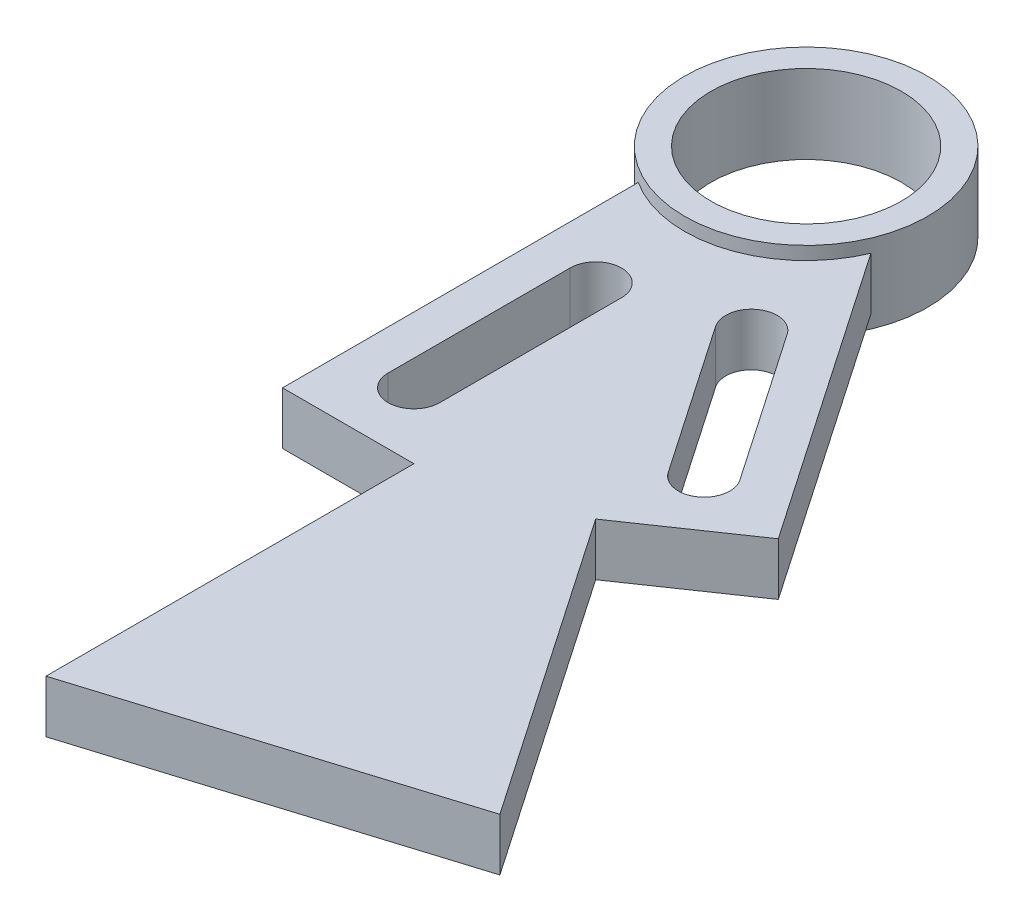
ISO-10303-21;
HEADER;
FILE_DESCRIPTION(('STEP AP214'),'2;1');
FILE_NAME('part.step','',(''),(''),'','','');
FILE_SCHEMA(('AUTOMOTIVE_DESIGN { 1 0 10303 214 1 1 1 1 }'));
ENDSEC;
DATA;
#1=APPLICATION_CONTEXT('core data for automotive mechanical design processes');
#2=APPLICATION_PROTOCOL_DEFINITION('international standard','automotive_design',2000,#1);
#3=PRODUCT_CONTEXT('',#1,'mechanical');
#4=PRODUCT('Part','Part','',(#3));
#5=PRODUCT_RELATED_PRODUCT_CATEGORY('part','',(#4));
#6=PRODUCT_DEFINITION_FORMATION('','',#4);
#7=PRODUCT_DEFINITION_CONTEXT('part definition',#1,'design');
#8=PRODUCT_DEFINITION('design','',#6,#7);
#9=PRODUCT_DEFINITION_SHAPE('','',#8);
#10=(LENGTH_UNIT() NAMED_UNIT(*) SI_UNIT(.MILLI.,.METRE.));
#11=(NAMED_UNIT(*) PLANE_ANGLE_UNIT() SI_UNIT($,.RADIAN.));
#12=(NAMED_UNIT(*) SI_UNIT($,.STERADIAN.) SOLID_ANGLE_UNIT());
#13=UNCERTAINTY_MEASURE_WITH_UNIT(LENGTH_MEASURE(1.E-05),#10,'distance_accuracy_value','');
#14=(GEOMETRIC_REPRESENTATION_CONTEXT(3) GLOBAL_UNCERTAINTY_ASSIGNED_CONTEXT((#13)) GLOBAL_UNIT_ASSIGNED_CONTEXT((#10,
#11,#12)) REPRESENTATION_CONTEXT('',''));
#15=CARTESIAN_POINT('',(0.,0.,0.));
#16=DIRECTION('',(0.,0.,1.));
#17=DIRECTION('',(1.,0.,0.));
#18=AXIS2_PLACEMENT_3D('',#15,#16,#17);
#19=CARTESIAN_POINT('',(0.,4.7625,0.));
#20=DIRECTION('',(0.,-1.,0.));
#21=DIRECTION('',(0.,0.,-1.));
#22=AXIS2_PLACEMENT_3D('',#19,#20,#21);
#23=CYLINDRICAL_SURFACE('',#22,11.5062);
#24=CARTESIAN_POINT('',(0.,4.7625,0.));
#25=DIRECTION('',(0.,1.,0.));
#26=DIRECTION('',(0.,0.,1.));
#27=AXIS2_PLACEMENT_3D('',#24,#25,#26);
#28=CIRCLE('',#27,11.5062);
#29=CARTESIAN_POINT('',(0.,4.7625,-11.5062));
#30=VERTEX_POINT('',#29);
#31=EDGE_CURVE('E51',#30,#30,#28,.T.);
#32=CARTESIAN_POINT('',(0.,-4.7625,0.));
#33=DIRECTION('',(0.,1.,0.));
#34=DIRECTION('',(0.,0.,1.));
#35=AXIS2_PLACEMENT_3D('',#32,#33,#34);
#36=CIRCLE('',#35,11.5062);
#37=CARTESIAN_POINT('',(0.,-4.7625,-11.5062));
#38=VERTEX_POINT('',#37);
#39=EDGE_CURVE('E271',#38,#38,#36,.T.);
#40=CARTESIAN_POINT('',(0.,4.7625,-11.5062));
#41=CARTESIAN_POINT('',(0.,4.66328125,-11.5062));
#42=CARTESIAN_POINT('',(0.,4.5640625,-11.5062));
#43=CARTESIAN_POINT('',(0.,4.365625,-11.5062));
#44=CARTESIAN_POINT('',(0.,4.26640625,-11.5062));
#45=CARTESIAN_POINT('',(0.,4.06796875,-11.5062));
#46=CARTESIAN_POINT('',(0.,3.96875,-11.5062));
#47=CARTESIAN_POINT('',(0.,3.7703125,-11.5062));
#48=CARTESIAN_POINT('',(0.,3.67109375,-11.5062));
#49=CARTESIAN_POINT('',(0.,3.47265625,-11.5062));
#50=CARTESIAN_POINT('',(0.,3.3734375,-11.5062));
#51=CARTESIAN_POINT('',(0.,3.175,-11.5062));
#52=CARTESIAN_POINT('',(0.,3.07578125,-11.5062));
#53=CARTESIAN_POINT('',(0.,2.87734375,-11.5062));
#54=CARTESIAN_POINT('',(0.,2.778125,-11.5062));
#55=CARTESIAN_POINT('',(0.,2.5796875,-11.5062));
#56=CARTESIAN_POINT('',(0.,2.48046875,-11.5062));
#57=CARTESIAN_POINT('',(0.,2.28203125,-11.5062));
#58=CARTESIAN_POINT('',(0.,2.1828125,-11.5062));
#59=CARTESIAN_POINT('',(0.,1.984375,-11.5062));
#60=CARTESIAN_POINT('',(0.,1.88515625,-11.5062));
#61=CARTESIAN_POINT('',(0.,1.68671875,-11.5062));
#62=CARTESIAN_POINT('',(0.,1.5875,-11.5062));
#63=CARTESIAN_POINT('',(0.,1.3890625,-11.5062));
#64=CARTESIAN_POINT('',(0.,1.28984375,-11.5062));
#65=CARTESIAN_POINT('',(0.,1.09140625,-11.5062));
#66=CARTESIAN_POINT('',(0.,0.992187499999999,-11.5062));
#67=CARTESIAN_POINT('',(0.,0.79375,-11.5062));
#68=CARTESIAN_POINT('',(0.,0.69453125,-11.5062));
#69=CARTESIAN_POINT('',(0.,0.49609375,-11.5062));
#70=CARTESIAN_POINT('',(0.,0.396875,-11.5062));
#71=CARTESIAN_POINT('',(0.,0.1984375,-11.5062));
#72=CARTESIAN_POINT('',(0.,0.0992187500000001,-11.5062));
#73=CARTESIAN_POINT('',(0.,-0.0992187500000001,-11.5062));
#74=CARTESIAN_POINT('',(0.,-0.1984375,-11.5062));
#75=CARTESIAN_POINT('',(0.,-0.396875,-11.5062));
#76=CARTESIAN_POINT('',(0.,-0.49609375,-11.5062));
#77=CARTESIAN_POINT('',(0.,-0.69453125,-11.5062));
#78=CARTESIAN_POINT('',(0.,-0.793750000000001,-11.5062));
#79=CARTESIAN_POINT('',(0.,-0.992187500000001,-11.5062));
#80=CARTESIAN_POINT('',(0.,-1.09140625,-11.5062));
#81=CARTESIAN_POINT('',(0.,-1.28984375,-11.5062));
#82=CARTESIAN_POINT('',(0.,-1.3890625,-11.5062));
#83=CARTESIAN_POINT('',(0.,-1.5875,-11.5062));
#84=CARTESIAN_POINT('',(0.,-1.68671875,-11.5062));
#85=CARTESIAN_POINT('',(0.,-1.88515625,-11.5062));
#86=CARTESIAN_POINT('',(0.,-1.984375,-11.5062));
#87=CARTESIAN_POINT('',(0.,-2.1828125,-11.5062));
#88=CARTESIAN_POINT('',(0.,-2.28203125,-11.5062));
#89=CARTESIAN_POINT('',(0.,-2.48046875,-11.5062));
#90=CARTESIAN_POINT('',(0.,-2.5796875,-11.5062));
#91=CARTESIAN_POINT('',(0.,-2.778125,-11.5062));
#92=CARTESIAN_POINT('',(0.,-2.87734375,-11.5062));
#93=CARTESIAN_POINT('',(0.,-3.07578125,-11.5062));
#94=CARTESIAN_POINT('',(0.,-3.175,-11.5062));
#95=CARTESIAN_POINT('',(0.,-3.3734375,-11.5062));
#96=CARTESIAN_POINT('',(0.,-3.47265625,-11.5062));
#97=CARTESIAN_POINT('',(0.,-3.67109375,-11.5062));
#98=CARTESIAN_POINT('',(0.,-3.7703125,-11.5062));
#99=CARTESIAN_POINT('',(0.,-3.96875,-11.5062));
#100=CARTESIAN_POINT('',(0.,-4.06796875,-11.5062));
#101=CARTESIAN_POINT('',(0.,-4.26640625,-11.5062));
#102=CARTESIAN_POINT('',(0.,-4.365625,-11.5062));
#103=CARTESIAN_POINT('',(0.,-4.5640625,-11.5062));
#104=CARTESIAN_POINT('',(0.,-4.66328125,-11.5062));
#105=CARTESIAN_POINT('',(0.,-4.7625,-11.5062));
#106=B_SPLINE_CURVE_WITH_KNOTS('',3,(#40,#41,#42,#43,#44,#45,#46,#47,#48,#49,#50,#51,#52,#53,
#54,#55,#56,#57,#58,#59,#60,#61,#62,#63,#64,#65,#66,#67,#68,#69,#70,#71,#72,#73,#74,#75,#76,#77,
#78,#79,#80,#81,#82,#83,#84,#85,#86,#87,#88,#89,#90,#91,#92,#93,#94,#95,#96,#97,#98,#99,#100,
#101,#102,#103,#104,#105),.UNSPECIFIED.,.F.,.F.,(4,2,2,2,2,2,2,2,2,2,2,2,2,2,2,2,2,2,2,2,2,2,2,
2,2,2,2,2,2,2,2,2,4),(0.,0.29765625,0.5953125,0.892968750000001,1.190625,1.48828125,1.7859375,
2.08359375,2.38125,2.67890625,2.9765625,3.27421875,3.571875,3.86953125,4.1671875,4.46484375,
4.7625,5.06015625,5.3578125,5.65546875,5.953125,6.25078125,6.5484375,6.84609375,7.14375,
7.44140625,7.7390625,8.03671875,8.334375,8.63203125,8.9296875,9.22734375,9.525),.UNSPECIFIED.);
#107=EDGE_CURVE('BSEAM43',#30,#38,#106,.T.);
#108=ORIENTED_EDGE('',*,*,#31,.T.);
#109=ORIENTED_EDGE('',*,*,#39,.F.);
#110=ORIENTED_EDGE('',*,*,#107,.T.);
#111=ORIENTED_EDGE('',*,*,#107,.F.);
#112=EDGE_LOOP('',(#108,#110,#109,#111));
#113=FACE_BOUND('',#112,.T.);
#114=ADVANCED_FACE('F43',(#113),#23,.F.);
#115=CARTESIAN_POINT('',(0.,4.7625,0.));
#116=DIRECTION('',(0.,-1.,0.));
#117=DIRECTION('',(0.,0.,-1.));
#118=AXIS2_PLACEMENT_3D('',#115,#116,#117);
#119=CYLINDRICAL_SURFACE('',#118,14.6812);
#120=DIRECTION('',(0.,-1.,0.));
#121=VECTOR('',#120,1.);
#122=CARTESIAN_POINT('',(-7.93749999999998,3.175,12.3504545337409));
#123=LINE('',#122,#121);
#124=CARTESIAN_POINT('',(-7.93749999999998,3.175,12.3504545337409));
#125=VERTEX_POINT('',#124);
#126=CARTESIAN_POINT('',(-7.93749999999998,-3.175,12.3504545337409));
#127=VERTEX_POINT('',#126);
#128=EDGE_CURVE('E64',#125,#127,#123,.T.);
#129=ORIENTED_EDGE('',*,*,#128,.F.);
#130=CARTESIAN_POINT('',(0.,3.175,0.));
#131=DIRECTION('',(0.,1.,0.));
#132=DIRECTION('',(0.,0.,1.));
#133=AXIS2_PLACEMENT_3D('',#130,#131,#132);
#134=CIRCLE('',#133,14.6812);
#135=CARTESIAN_POINT('',(13.5264297592823,3.175,5.70730509147716));
#136=VERTEX_POINT('',#135);
#137=EDGE_CURVE('E59',#125,#136,#134,.T.);
#138=ORIENTED_EDGE('',*,*,#137,.T.);
#139=DIRECTION('',(0.,-1.,0.));
#140=VECTOR('',#139,1.);
#141=CARTESIAN_POINT('',(13.5264297592823,3.175,5.70730509147716));
#142=LINE('',#141,#140);
#143=CARTESIAN_POINT('',(13.5264297592823,-3.175,5.70730509147716));
#144=VERTEX_POINT('',#143);
#145=EDGE_CURVE('E282',#136,#144,#142,.T.);
#146=ORIENTED_EDGE('',*,*,#145,.T.);
#147=CARTESIAN_POINT('',(0.,-3.175,0.));
#148=DIRECTION('',(0.,1.,0.));
#149=DIRECTION('',(0.,0.,1.));
#150=AXIS2_PLACEMENT_3D('',#147,#148,#149);
#151=CIRCLE('',#150,14.6812);
#152=EDGE_CURVE('E236',#127,#144,#151,.T.);
#153=ORIENTED_EDGE('',*,*,#152,.F.);
#154=EDGE_LOOP('',(#129,#138,#146,#153));
#155=FACE_BOUND('',#154,.T.);
#156=CARTESIAN_POINT('',(0.,4.7625,0.));
#157=DIRECTION('',(0.,1.,0.));
#158=DIRECTION('',(0.,0.,1.));
#159=AXIS2_PLACEMENT_3D('',#156,#157,#158);
#160=CIRCLE('',#159,14.6812);
#161=CARTESIAN_POINT('',(0.,4.7625,14.6812));
#162=VERTEX_POINT('',#161);
#163=EDGE_CURVE('E11',#162,#162,#160,.T.);
#164=ORIENTED_EDGE('',*,*,#163,.F.);
#165=EDGE_LOOP('',(#164));
#166=FACE_BOUND('',#165,.T.);
#167=CARTESIAN_POINT('',(0.,-4.7625,0.));
#168=DIRECTION('',(0.,1.,0.));
#169=DIRECTION('',(0.,0.,1.));
#170=AXIS2_PLACEMENT_3D('',#167,#168,#169);
#171=CIRCLE('',#170,14.6812);
#172=CARTESIAN_POINT('',(0.,-4.7625,14.6812));
#173=VERTEX_POINT('',#172);
#174=EDGE_CURVE('E46',#173,#173,#171,.T.);
#175=ORIENTED_EDGE('',*,*,#174,.T.);
#176=EDGE_LOOP('',(#175));
#177=FACE_BOUND('',#176,.T.);
#178=ADVANCED_FACE('F299',(#155,#166,#177),#119,.T.);
#179=CARTESIAN_POINT('',(0.,4.7625,0.));
#180=DIRECTION('',(0.,1.,0.));
#181=DIRECTION('',(0.,0.,1.));
#182=AXIS2_PLACEMENT_3D('',#179,#180,#181);
#183=PLANE('',#182);
#184=ORIENTED_EDGE('',*,*,#31,.F.);
#185=EDGE_LOOP('',(#184));
#186=FACE_BOUND('',#185,.T.);
#187=ORIENTED_EDGE('',*,*,#163,.T.);
#188=EDGE_LOOP('',(#187));
#189=FACE_BOUND('',#188,.T.);
#190=ADVANCED_FACE('F304',(#186,#189),#183,.T.);
#191=CARTESIAN_POINT('',(0.,-4.7625,0.));
#192=DIRECTION('',(0.,1.,0.));
#193=DIRECTION('',(0.,0.,1.));
#194=AXIS2_PLACEMENT_3D('',#191,#192,#193);
#195=PLANE('',#194);
#196=ORIENTED_EDGE('',*,*,#39,.T.);
#197=EDGE_LOOP('',(#196));
#198=FACE_BOUND('',#197,.T.);
#199=ORIENTED_EDGE('',*,*,#174,.F.);
#200=EDGE_LOOP('',(#199));
#201=FACE_BOUND('',#200,.T.);
#202=ADVANCED_FACE('F301',(#198,#201),#195,.F.);
#203=CARTESIAN_POINT('',(0.,3.175,25.4127));
#204=DIRECTION('',(0.,-1.,0.));
#205=DIRECTION('',(0.,0.,-1.));
#206=AXIS2_PLACEMENT_3D('',#203,#204,#205);
#207=CYLINDRICAL_SURFACE('',#206,3.1115);
#208=CARTESIAN_POINT('',(0.,-3.175,25.4127));
#209=DIRECTION('',(0.,1.,0.));
#210=DIRECTION('',(0.,0.,1.));
#211=AXIS2_PLACEMENT_3D('',#208,#209,#210);
#212=CIRCLE('',#211,3.1115);
#213=CARTESIAN_POINT('',(3.1115,-3.175,25.4127));
#214=VERTEX_POINT('',#213);
#215=CARTESIAN_POINT('',(-3.11150000000001,-3.175,25.4127));
#216=VERTEX_POINT('',#215);
#217=EDGE_CURVE('E251',#214,#216,#212,.T.);
#218=ORIENTED_EDGE('',*,*,#217,.F.);
#219=DIRECTION('',(0.,-1.,0.));
#220=VECTOR('',#219,1.);
#221=CARTESIAN_POINT('',(3.1115,3.175,25.4127));
#222=LINE('',#221,#220);
#223=CARTESIAN_POINT('',(3.1115,3.175,25.4127));
#224=VERTEX_POINT('',#223);
#225=EDGE_CURVE('E269',#224,#214,#222,.T.);
#226=ORIENTED_EDGE('',*,*,#225,.F.);
#227=CARTESIAN_POINT('',(0.,3.175,25.4127));
#228=DIRECTION('',(0.,1.,0.));
#229=DIRECTION('',(0.,0.,1.));
#230=AXIS2_PLACEMENT_3D('',#227,#228,#229);
#231=CIRCLE('',#230,3.1115);
#232=CARTESIAN_POINT('',(-3.11150000000001,3.175,25.4127));
#233=VERTEX_POINT('',#232);
#234=EDGE_CURVE('E206',#224,#233,#231,.T.);
#235=ORIENTED_EDGE('',*,*,#234,.T.);
#236=DIRECTION('',(0.,-1.,0.));
#237=VECTOR('',#236,1.);
#238=CARTESIAN_POINT('',(-3.11150000000001,3.175,25.4127));
#239=LINE('',#238,#237);
#240=EDGE_CURVE('E262',#233,#216,#239,.T.);
#241=ORIENTED_EDGE('',*,*,#240,.T.);
#242=EDGE_LOOP('',(#218,#226,#235,#241));
#243=FACE_BOUND('',#242,.T.);
#244=ADVANCED_FACE('F303',(#243),#207,.F.);
#245=CARTESIAN_POINT('',(3.11149999999999,3.175,0.));
#246=DIRECTION('',(-1.,0.,0.));
#247=DIRECTION('',(0.,0.,1.));
#248=AXIS2_PLACEMENT_3D('',#245,#246,#247);
#249=PLANE('',#248);
#250=DIRECTION('',(0.,0.,-1.));
#251=VECTOR('',#250,1.);
#252=CARTESIAN_POINT('',(3.11149999999999,-3.175,0.));
#253=LINE('',#252,#251);
#254=CARTESIAN_POINT('',(3.1115,-3.175,47.3837));
#255=VERTEX_POINT('',#254);
#256=EDGE_CURVE('E254',#255,#214,#253,.T.);
#257=ORIENTED_EDGE('',*,*,#256,.F.);
#258=DIRECTION('',(0.,-1.,0.));
#259=VECTOR('',#258,1.);
#260=CARTESIAN_POINT('',(3.1115,3.175,47.3837));
#261=LINE('',#260,#259);
#262=CARTESIAN_POINT('',(3.1115,3.175,47.3837));
#263=VERTEX_POINT('',#262);
#264=EDGE_CURVE('E267',#263,#255,#261,.T.);
#265=ORIENTED_EDGE('',*,*,#264,.F.);
#266=DIRECTION('',(0.,0.,-1.));
#267=VECTOR('',#266,1.);
#268=CARTESIAN_POINT('',(3.11149999999999,3.175,0.));
#269=LINE('',#268,#267);
#270=EDGE_CURVE('E209',#263,#224,#269,.T.);
#271=ORIENTED_EDGE('',*,*,#270,.T.);
#272=ORIENTED_EDGE('',*,*,#225,.T.);
#273=EDGE_LOOP('',(#257,#265,#271,#272));
#274=FACE_BOUND('',#273,.T.);
#275=ADVANCED_FACE('F311',(#274),#249,.T.);
#276=CARTESIAN_POINT('',(0.,3.175,47.3837));
#277=DIRECTION('',(0.,-1.,0.));
#278=DIRECTION('',(0.,0.,-1.));
#279=AXIS2_PLACEMENT_3D('',#276,#277,#278);
#280=CYLINDRICAL_SURFACE('',#279,3.1115);
#281=CARTESIAN_POINT('',(0.,-3.175,47.3837));
#282=DIRECTION('',(0.,1.,0.));
#283=DIRECTION('',(0.,0.,1.));
#284=AXIS2_PLACEMENT_3D('',#281,#282,#283);
#285=CIRCLE('',#284,3.1115);
#286=CARTESIAN_POINT('',(-3.1115,-3.175,47.3837));
#287=VERTEX_POINT('',#286);
#288=EDGE_CURVE('E257',#287,#255,#285,.T.);
#289=ORIENTED_EDGE('',*,*,#288,.F.);
#290=DIRECTION('',(0.,-1.,0.));
#291=VECTOR('',#290,1.);
#292=CARTESIAN_POINT('',(-3.1115,3.175,47.3837));
#293=LINE('',#292,#291);
#294=CARTESIAN_POINT('',(-3.1115,3.175,47.3837));
#295=VERTEX_POINT('',#294);
#296=EDGE_CURVE('E264',#295,#287,#293,.T.);
#297=ORIENTED_EDGE('',*,*,#296,.F.);
#298=CARTESIAN_POINT('',(0.,3.175,47.3837));
#299=DIRECTION('',(0.,1.,0.));
#300=DIRECTION('',(0.,0.,1.));
#301=AXIS2_PLACEMENT_3D('',#298,#299,#300);
#302=CIRCLE('',#301,3.1115);
#303=EDGE_CURVE('E212',#295,#263,#302,.T.);
#304=ORIENTED_EDGE('',*,*,#303,.T.);
#305=ORIENTED_EDGE('',*,*,#264,.T.);
#306=EDGE_LOOP('',(#289,#297,#304,#305));
#307=FACE_BOUND('',#306,.T.);
#308=ADVANCED_FACE('F340',(#307),#280,.F.);
#309=CARTESIAN_POINT('',(-6.54973750062605,3.175,4.48384265144171));
#310=DIRECTION('',(0.825163779606464,0.,-0.56489356238638));
#311=DIRECTION('',(-0.56489356238638,0.,-0.825163779606464));
#312=AXIS2_PLACEMENT_3D('',#309,#310,#311);
#313=PLANE('',#312);
#314=DIRECTION('',(0.56489356238638,0.,0.825163779606464));
#315=VECTOR('',#314,1.);
#316=CARTESIAN_POINT('',(-6.54973750062605,-3.175,4.48384265144171));
#317=LINE('',#316,#315);
#318=CARTESIAN_POINT('',(24.7008522428634,-3.175,50.1328931358069));
#319=VERTEX_POINT('',#318);
#320=CARTESIAN_POINT('',(49.8103710909379,-3.175,86.8114231393142));
#321=VERTEX_POINT('',#320);
#322=EDGE_CURVE('E227',#319,#321,#317,.T.);
#323=ORIENTED_EDGE('',*,*,#322,.F.);
#324=DIRECTION('',(0.,-1.,0.));
#325=VECTOR('',#324,1.);
#326=CARTESIAN_POINT('',(24.7008522428634,3.175,50.1328931358069));
#327=LINE('',#326,#325);
#328=CARTESIAN_POINT('',(24.7008522428634,3.175,50.1328931358069));
#329=VERTEX_POINT('',#328);
#330=EDGE_CURVE('E265',#329,#319,#327,.T.);
#331=ORIENTED_EDGE('',*,*,#330,.F.);
#332=DIRECTION('',(0.56489356238638,0.,0.825163779606464));
#333=VECTOR('',#332,1.);
#334=CARTESIAN_POINT('',(-6.54973750062605,3.175,4.48384265144171));
#335=LINE('',#334,#333);
#336=CARTESIAN_POINT('',(49.8103710909379,3.175,86.8114231393142));
#337=VERTEX_POINT('',#336);
#338=EDGE_CURVE('E186',#329,#337,#335,.T.);
#339=ORIENTED_EDGE('',*,*,#338,.T.);
#340=DIRECTION('',(0.,-1.,0.));
#341=VECTOR('',#340,1.);
#342=CARTESIAN_POINT('',(49.8103710909379,3.175,86.8114231393142));
#343=LINE('',#342,#341);
#344=EDGE_CURVE('E165',#337,#321,#343,.T.);
#345=ORIENTED_EDGE('',*,*,#344,.T.);
#346=EDGE_LOOP('',(#323,#331,#339,#345));
#347=FACE_BOUND('',#346,.T.);
#348=ADVANCED_FACE('F349',(#347),#313,.T.);
#349=CARTESIAN_POINT('',(31.2505897434894,3.175,45.6490504843651));
#350=DIRECTION('',(-0.56489356238638,0.,-0.825163779606464));
#351=DIRECTION('',(-0.825163779606464,0.,0.56489356238638));
#352=AXIS2_PLACEMENT_3D('',#349,#350,#351);
#353=PLANE('',#352);
#354=DIRECTION('',(0.825163779606464,0.,-0.56489356238638));
#355=VECTOR('',#354,1.);
#356=CARTESIAN_POINT('',(31.2505897434894,-3.175,45.6490504843651));
#357=LINE('',#356,#355);
#358=CARTESIAN_POINT('',(37.800327244116,-3.175,41.1652078329231));
#359=VERTEX_POINT('',#358);
#360=EDGE_CURVE('E230',#319,#359,#357,.T.);
#361=ORIENTED_EDGE('',*,*,#360,.T.);
#362=DIRECTION('',(0.,-1.,0.));
#363=VECTOR('',#362,1.);
#364=CARTESIAN_POINT('',(37.800327244116,3.175,41.1652078329231));
#365=LINE('',#364,#363);
#366=CARTESIAN_POINT('',(37.800327244116,3.175,41.1652078329231));
#367=VERTEX_POINT('',#366);
#368=EDGE_CURVE('E284',#367,#359,#365,.T.);
#369=ORIENTED_EDGE('',*,*,#368,.F.);
#370=DIRECTION('',(0.825163779606464,0.,-0.56489356238638));
#371=VECTOR('',#370,1.);
#372=CARTESIAN_POINT('',(31.2505897434894,3.175,45.6490504843651));
#373=LINE('',#372,#371);
#374=EDGE_CURVE('E189',#329,#367,#373,.T.);
#375=ORIENTED_EDGE('',*,*,#374,.F.);
#376=ORIENTED_EDGE('',*,*,#330,.T.);
#377=EDGE_LOOP('',(#361,#369,#375,#376));
#378=FACE_BOUND('',#377,.T.);
#379=ADVANCED_FACE('F358',(#378),#353,.F.);
#380=CARTESIAN_POINT('',(6.54973750062657,3.175,-4.48384265144207));
#381=DIRECTION('',(-0.825163779606464,0.,0.56489356238638));
#382=DIRECTION('',(0.56489356238638,0.,0.825163779606464));
#383=AXIS2_PLACEMENT_3D('',#380,#381,#382);
#384=PLANE('',#383);
#385=DIRECTION('',(-0.56489356238638,0.,-0.825163779606464));
#386=VECTOR('',#385,1.);
#387=CARTESIAN_POINT('',(6.54973750062657,-3.175,-4.48384265144207));
#388=LINE('',#387,#386);
#389=EDGE_CURVE('E233',#359,#144,#388,.T.);
#390=ORIENTED_EDGE('',*,*,#389,.T.);
#391=ORIENTED_EDGE('',*,*,#145,.F.);
#392=DIRECTION('',(-0.56489356238638,0.,-0.825163779606464));
#393=VECTOR('',#392,1.);
#394=CARTESIAN_POINT('',(6.54973750062657,3.175,-4.48384265144207));
#395=LINE('',#394,#393);
#396=EDGE_CURVE('E192',#367,#136,#395,.T.);
#397=ORIENTED_EDGE('',*,*,#396,.F.);
#398=ORIENTED_EDGE('',*,*,#368,.T.);
#399=EDGE_LOOP('',(#390,#391,#397,#398));
#400=FACE_BOUND('',#399,.T.);
#401=ADVANCED_FACE('F367',(#400),#384,.F.);
#402=CARTESIAN_POINT('',(-7.93749999999998,3.175,0.));
#403=DIRECTION('',(-1.,0.,0.));
#404=DIRECTION('',(0.,0.,1.));
#405=AXIS2_PLACEMENT_3D('',#402,#403,#404);
#406=PLANE('',#405);
#407=DIRECTION('',(0.,0.,-1.));
#408=VECTOR('',#407,1.);
#409=CARTESIAN_POINT('',(-7.93749999999998,-3.175,0.));
#410=LINE('',#409,#408);
#411=CARTESIAN_POINT('',(-7.93749999999998,-3.175,55.3212));
#412=VERTEX_POINT('',#411);
#413=EDGE_CURVE('E239',#412,#127,#410,.T.);
#414=ORIENTED_EDGE('',*,*,#413,.F.);
#415=DIRECTION('',(0.,-1.,0.));
#416=VECTOR('',#415,1.);
#417=CARTESIAN_POINT('',(-7.93749999999998,3.175,55.3212));
#418=LINE('',#417,#416);
#419=CARTESIAN_POINT('',(-7.93749999999998,3.175,55.3212));
#420=VERTEX_POINT('',#419);
#421=EDGE_CURVE('E279',#420,#412,#418,.T.);
#422=ORIENTED_EDGE('',*,*,#421,.F.);
#423=DIRECTION('',(0.,0.,-1.));
#424=VECTOR('',#423,1.);
#425=CARTESIAN_POINT('',(-7.93749999999998,3.175,0.));
#426=LINE('',#425,#424);
#427=EDGE_CURVE('E195',#420,#125,#426,.T.);
#428=ORIENTED_EDGE('',*,*,#427,.T.);
#429=ORIENTED_EDGE('',*,*,#128,.T.);
#430=EDGE_LOOP('',(#414,#422,#428,#429));
#431=FACE_BOUND('',#430,.T.);
#432=ADVANCED_FACE('F376',(#431),#406,.T.);
#433=CARTESIAN_POINT('',(0.,3.175,55.3212));
#434=DIRECTION('',(0.,0.,-1.));
#435=DIRECTION('',(-1.,0.,0.));
#436=AXIS2_PLACEMENT_3D('',#433,#434,#435);
#437=PLANE('',#436);
#438=DIRECTION('',(1.,0.,0.));
#439=VECTOR('',#438,1.);
#440=CARTESIAN_POINT('',(0.,-3.175,55.3212));
#441=LINE('',#440,#439);
#442=CARTESIAN_POINT('',(7.93750000000002,-3.175,55.3212));
#443=VERTEX_POINT('',#442);
#444=EDGE_CURVE('E242',#412,#443,#441,.T.);
#445=ORIENTED_EDGE('',*,*,#444,.T.);
#446=DIRECTION('',(0.,-1.,0.));
#447=VECTOR('',#446,1.);
#448=CARTESIAN_POINT('',(7.93750000000002,3.175,55.3212));
#449=LINE('',#448,#447);
#450=CARTESIAN_POINT('',(7.93750000000002,3.175,55.3212));
#451=VERTEX_POINT('',#450);
#452=EDGE_CURVE('E276',#451,#443,#449,.T.);
#453=ORIENTED_EDGE('',*,*,#452,.F.);
#454=DIRECTION('',(1.,0.,0.));
#455=VECTOR('',#454,1.);
#456=CARTESIAN_POINT('',(0.,3.175,55.3212));
#457=LINE('',#456,#455);
#458=EDGE_CURVE('E198',#420,#451,#457,.T.);
#459=ORIENTED_EDGE('',*,*,#458,.F.);
#460=ORIENTED_EDGE('',*,*,#421,.T.);
#461=EDGE_LOOP('',(#445,#453,#459,#460));
#462=FACE_BOUND('',#461,.T.);
#463=ADVANCED_FACE('F385',(#462),#437,.F.);
#464=CARTESIAN_POINT('',(7.93750000000005,3.175,0.));
#465=DIRECTION('',(1.,0.,0.));
#466=DIRECTION('',(0.,0.,-1.));
#467=AXIS2_PLACEMENT_3D('',#464,#465,#466);
#468=PLANE('',#467);
#469=DIRECTION('',(0.,0.,1.));
#470=VECTOR('',#469,1.);
#471=CARTESIAN_POINT('',(7.93750000000005,-3.175,0.));
#472=LINE('',#471,#470);
#473=CARTESIAN_POINT('',(7.9375,-3.175,99.7712));
#474=VERTEX_POINT('',#473);
#475=EDGE_CURVE('E245',#443,#474,#472,.T.);
#476=ORIENTED_EDGE('',*,*,#475,.T.);
#477=DIRECTION('',(0.,-1.,0.));
#478=VECTOR('',#477,1.);
#479=CARTESIAN_POINT('',(7.9375,3.175,99.7712));
#480=LINE('',#479,#478);
#481=CARTESIAN_POINT('',(7.9375,3.175,99.7712));
#482=VERTEX_POINT('',#481);
#483=EDGE_CURVE('E273',#482,#474,#480,.T.);
#484=ORIENTED_EDGE('',*,*,#483,.F.);
#485=DIRECTION('',(0.,0.,1.));
#486=VECTOR('',#485,1.);
#487=CARTESIAN_POINT('',(7.93750000000005,3.175,0.));
#488=LINE('',#487,#486);
#489=EDGE_CURVE('E201',#451,#482,#488,.T.);
#490=ORIENTED_EDGE('',*,*,#489,.F.);
#491=ORIENTED_EDGE('',*,*,#452,.T.);
#492=EDGE_LOOP('',(#476,#484,#490,#491));
#493=FACE_BOUND('',#492,.T.);
#494=ADVANCED_FACE('F394',(#493),#468,.F.);
#495=CARTESIAN_POINT('',(26.7667470920478,3.175,39.0993129837386));
#496=DIRECTION('',(0.,-1.,0.));
#497=DIRECTION('',(0.,0.,-1.));
#498=AXIS2_PLACEMENT_3D('',#495,#496,#497);
#499=CYLINDRICAL_SURFACE('',#498,3.1115);
#500=CARTESIAN_POINT('',(26.7667470920478,-3.175,39.0993129837386));
#501=DIRECTION('',(0.,1.,0.));
#502=DIRECTION('',(0.,0.,1.));
#503=AXIS2_PLACEMENT_3D('',#500,#501,#502);
#504=CIRCLE('',#503,3.1115);
#505=CARTESIAN_POINT('',(24.1992499918023,-3.175,40.8569793031039));
#506=VERTEX_POINT('',#505);
#507=CARTESIAN_POINT('',(29.3342441922933,-3.175,37.3416466643734));
#508=VERTEX_POINT('',#507);
#509=EDGE_CURVE('E160',#506,#508,#504,.T.);
#510=ORIENTED_EDGE('',*,*,#509,.F.);
#511=DIRECTION('',(0.,-1.,0.));
#512=VECTOR('',#511,1.);
#513=CARTESIAN_POINT('',(24.1992499918023,3.175,40.8569793031039));
#514=LINE('',#513,#512);
#515=CARTESIAN_POINT('',(24.1992499918023,3.175,40.8569793031039));
#516=VERTEX_POINT('',#515);
#517=EDGE_CURVE('E155',#516,#506,#514,.T.);
#518=ORIENTED_EDGE('',*,*,#517,.F.);
#519=CARTESIAN_POINT('',(26.7667470920478,3.175,39.0993129837386));
#520=DIRECTION('',(0.,1.,0.));
#521=DIRECTION('',(0.,0.,1.));
#522=AXIS2_PLACEMENT_3D('',#519,#520,#521);
#523=CIRCLE('',#522,3.1115);
#524=CARTESIAN_POINT('',(29.3342441922933,3.175,37.3416466643734));
#525=VERTEX_POINT('',#524);
#526=EDGE_CURVE('E158',#516,#525,#523,.T.);
#527=ORIENTED_EDGE('',*,*,#526,.T.);
#528=DIRECTION('',(0.,-1.,0.));
#529=VECTOR('',#528,1.);
#530=CARTESIAN_POINT('',(29.3342441922933,3.175,37.3416466643734));
#531=LINE('',#530,#529);
#532=EDGE_CURVE('E217',#525,#508,#531,.T.);
#533=ORIENTED_EDGE('',*,*,#532,.T.);
#534=EDGE_LOOP('',(#510,#518,#527,#533));
#535=FACE_BOUND('',#534,.T.);
#536=ADVANCED_FACE('F157',(#535),#499,.F.);
#537=CARTESIAN_POINT('',(-2.56749710024526,3.175,1.75766631936504));
#538=DIRECTION('',(0.825163779606464,0.,-0.56489356238638));
#539=DIRECTION('',(-0.56489356238638,0.,-0.825163779606464));
#540=AXIS2_PLACEMENT_3D('',#537,#538,#539);
#541=PLANE('',#540);
#542=DIRECTION('',(0.56489356238638,0.,0.825163779606464));
#543=VECTOR('',#542,1.);
#544=CARTESIAN_POINT('',(-2.56749710024526,-3.175,1.75766631936504));
#545=LINE('',#544,#543);
#546=CARTESIAN_POINT('',(11.7879735326111,-3.175,22.7273059013703));
#547=VERTEX_POINT('',#546);
#548=EDGE_CURVE('E219',#547,#506,#545,.T.);
#549=ORIENTED_EDGE('',*,*,#548,.F.);
#550=DIRECTION('',(0.,-1.,0.));
#551=VECTOR('',#550,1.);
#552=CARTESIAN_POINT('',(11.7879735326111,3.175,22.7273059013703));
#553=LINE('',#552,#551);
#554=CARTESIAN_POINT('',(11.7879735326111,3.175,22.7273059013703));
#555=VERTEX_POINT('',#554);
#556=EDGE_CURVE('E166',#555,#547,#553,.T.);
#557=ORIENTED_EDGE('',*,*,#556,.F.);
#558=DIRECTION('',(0.56489356238638,0.,0.825163779606464));
#559=VECTOR('',#558,1.);
#560=CARTESIAN_POINT('',(-2.56749710024526,3.175,1.75766631936504));
#561=LINE('',#560,#559);
#562=EDGE_CURVE('E173',#555,#516,#561,.T.);
#563=ORIENTED_EDGE('',*,*,#562,.T.);
#564=ORIENTED_EDGE('',*,*,#517,.T.);
#565=EDGE_LOOP('',(#549,#557,#563,#564));
#566=FACE_BOUND('',#565,.T.);
#567=ADVANCED_FACE('F180',(#566),#541,.T.);
#568=CARTESIAN_POINT('',(14.3554706328566,3.175,20.969639582005));
#569=DIRECTION('',(0.,-1.,0.));
#570=DIRECTION('',(0.,0.,-1.));
#571=AXIS2_PLACEMENT_3D('',#568,#569,#570);
#572=CYLINDRICAL_SURFACE('',#571,3.1115);
#573=CARTESIAN_POINT('',(14.3554706328566,-3.175,20.969639582005));
#574=DIRECTION('',(0.,1.,0.));
#575=DIRECTION('',(0.,0.,1.));
#576=AXIS2_PLACEMENT_3D('',#573,#574,#575);
#577=CIRCLE('',#576,3.1115);
#578=CARTESIAN_POINT('',(16.9229677331021,-3.175,19.2119732626398));
#579=VERTEX_POINT('',#578);
#580=EDGE_CURVE('E221',#579,#547,#577,.T.);
#581=ORIENTED_EDGE('',*,*,#580,.F.);
#582=DIRECTION('',(0.,-1.,0.));
#583=VECTOR('',#582,1.);
#584=CARTESIAN_POINT('',(16.9229677331021,3.175,19.2119732626398));
#585=LINE('',#584,#583);
#586=CARTESIAN_POINT('',(16.9229677331021,3.175,19.2119732626398));
#587=VERTEX_POINT('',#586);
#588=EDGE_CURVE('E289',#587,#579,#585,.T.);
#589=ORIENTED_EDGE('',*,*,#588,.F.);
#590=CARTESIAN_POINT('',(14.3554706328566,3.175,20.969639582005));
#591=DIRECTION('',(0.,1.,0.));
#592=DIRECTION('',(0.,0.,1.));
#593=AXIS2_PLACEMENT_3D('',#590,#591,#592);
#594=CIRCLE('',#593,3.1115);
#595=EDGE_CURVE('E181',#587,#555,#594,.T.);
#596=ORIENTED_EDGE('',*,*,#595,.T.);
#597=ORIENTED_EDGE('',*,*,#556,.T.);
#598=EDGE_LOOP('',(#581,#589,#596,#597));
#599=FACE_BOUND('',#598,.T.);
#600=ADVANCED_FACE('F418',(#599),#572,.F.);
#601=CARTESIAN_POINT('',(28.8739355454689,3.175,93.2913115696571));
#602=DIRECTION('',(-0.295665537722557,0.,-0.955291520847553));
#603=DIRECTION('',(-0.955291520847553,0.,0.295665537722557));
#604=AXIS2_PLACEMENT_3D('',#601,#602,#603);
#605=PLANE('',#604);
#606=DIRECTION('',(0.955291520847553,0.,-0.295665537722557));
#607=VECTOR('',#606,1.);
#608=CARTESIAN_POINT('',(28.8739355454689,-3.175,93.2913115696571));
#609=LINE('',#608,#607);
#610=EDGE_CURVE('E248',#474,#321,#609,.T.);
#611=ORIENTED_EDGE('',*,*,#610,.T.);
#612=ORIENTED_EDGE('',*,*,#344,.F.);
#613=DIRECTION('',(0.955291520847553,0.,-0.295665537722557));
#614=VECTOR('',#613,1.);
#615=CARTESIAN_POINT('',(28.8739355454689,3.175,93.2913115696571));
#616=LINE('',#615,#614);
#617=EDGE_CURVE('E204',#482,#337,#616,.T.);
#618=ORIENTED_EDGE('',*,*,#617,.F.);
#619=ORIENTED_EDGE('',*,*,#483,.T.);
#620=EDGE_LOOP('',(#611,#612,#618,#619));
#621=FACE_BOUND('',#620,.T.);
#622=ADVANCED_FACE('F426',(#621),#605,.F.);
#623=CARTESIAN_POINT('',(2.56749710024576,3.175,-1.75766631936539));
#624=DIRECTION('',(0.825163779606464,0.,-0.56489356238638));
#625=DIRECTION('',(-0.56489356238638,0.,-0.825163779606464));
#626=AXIS2_PLACEMENT_3D('',#623,#624,#625);
#627=PLANE('',#626);
#628=DIRECTION('',(0.56489356238638,0.,0.825163779606464));
#629=VECTOR('',#628,1.);
#630=CARTESIAN_POINT('',(2.56749710024576,-3.175,-1.75766631936539));
#631=LINE('',#630,#629);
#632=EDGE_CURVE('E224',#579,#508,#631,.T.);
#633=ORIENTED_EDGE('',*,*,#632,.T.);
#634=ORIENTED_EDGE('',*,*,#532,.F.);
#635=DIRECTION('',(0.56489356238638,0.,0.825163779606464));
#636=VECTOR('',#635,1.);
#637=CARTESIAN_POINT('',(2.56749710024576,3.175,-1.75766631936539));
#638=LINE('',#637,#636);
#639=EDGE_CURVE('E176',#587,#525,#638,.T.);
#640=ORIENTED_EDGE('',*,*,#639,.F.);
#641=ORIENTED_EDGE('',*,*,#588,.T.);
#642=EDGE_LOOP('',(#633,#634,#640,#641));
#643=FACE_BOUND('',#642,.T.);
#644=ADVANCED_FACE('F435',(#643),#627,.F.);
#645=CARTESIAN_POINT('',(-3.11150000000001,3.175,0.));
#646=DIRECTION('',(-1.,0.,0.));
#647=DIRECTION('',(0.,0.,1.));
#648=AXIS2_PLACEMENT_3D('',#645,#646,#647);
#649=PLANE('',#648);
#650=DIRECTION('',(0.,0.,-1.));
#651=VECTOR('',#650,1.);
#652=CARTESIAN_POINT('',(-3.11150000000001,-3.175,0.));
#653=LINE('',#652,#651);
#654=EDGE_CURVE('E178',#287,#216,#653,.T.);
#655=ORIENTED_EDGE('',*,*,#654,.T.);
#656=ORIENTED_EDGE('',*,*,#240,.F.);
#657=DIRECTION('',(0.,0.,-1.));
#658=VECTOR('',#657,1.);
#659=CARTESIAN_POINT('',(-3.11150000000001,3.175,0.));
#660=LINE('',#659,#658);
#661=EDGE_CURVE('E215',#295,#233,#660,.T.);
#662=ORIENTED_EDGE('',*,*,#661,.F.);
#663=ORIENTED_EDGE('',*,*,#296,.T.);
#664=EDGE_LOOP('',(#655,#656,#662,#663));
#665=FACE_BOUND('',#664,.T.);
#666=ADVANCED_FACE('F444',(#665),#649,.F.);
#667=CARTESIAN_POINT('',(0.,3.175,0.));
#668=DIRECTION('',(0.,1.,0.));
#669=DIRECTION('',(0.,0.,1.));
#670=AXIS2_PLACEMENT_3D('',#667,#668,#669);
#671=PLANE('',#670);
#672=ORIENTED_EDGE('',*,*,#526,.F.);
#673=ORIENTED_EDGE('',*,*,#562,.F.);
#674=ORIENTED_EDGE('',*,*,#595,.F.);
#675=ORIENTED_EDGE('',*,*,#639,.T.);
#676=EDGE_LOOP('',(#672,#673,#674,#675));
#677=FACE_BOUND('',#676,.T.);
#678=ORIENTED_EDGE('',*,*,#338,.F.);
#679=ORIENTED_EDGE('',*,*,#374,.T.);
#680=ORIENTED_EDGE('',*,*,#396,.T.);
#681=ORIENTED_EDGE('',*,*,#137,.F.);
#682=ORIENTED_EDGE('',*,*,#427,.F.);
#683=ORIENTED_EDGE('',*,*,#458,.T.);
#684=ORIENTED_EDGE('',*,*,#489,.T.);
#685=ORIENTED_EDGE('',*,*,#617,.T.);
#686=EDGE_LOOP('',(#678,#679,#680,#681,#682,#683,#684,#685));
#687=FACE_BOUND('',#686,.T.);
#688=ORIENTED_EDGE('',*,*,#234,.F.);
#689=ORIENTED_EDGE('',*,*,#270,.F.);
#690=ORIENTED_EDGE('',*,*,#303,.F.);
#691=ORIENTED_EDGE('',*,*,#661,.T.);
#692=EDGE_LOOP('',(#688,#689,#690,#691));
#693=FACE_BOUND('',#692,.T.);
#694=ADVANCED_FACE('F170',(#677,#687,#693),#671,.T.);
#695=CARTESIAN_POINT('',(0.,-3.175,0.));
#696=DIRECTION('',(0.,1.,0.));
#697=DIRECTION('',(0.,0.,1.));
#698=AXIS2_PLACEMENT_3D('',#695,#696,#697);
#699=PLANE('',#698);
#700=ORIENTED_EDGE('',*,*,#509,.T.);
#701=ORIENTED_EDGE('',*,*,#632,.F.);
#702=ORIENTED_EDGE('',*,*,#580,.T.);
#703=ORIENTED_EDGE('',*,*,#548,.T.);
#704=EDGE_LOOP('',(#700,#701,#702,#703));
#705=FACE_BOUND('',#704,.T.);
#706=ORIENTED_EDGE('',*,*,#322,.T.);
#707=ORIENTED_EDGE('',*,*,#610,.F.);
#708=ORIENTED_EDGE('',*,*,#475,.F.);
#709=ORIENTED_EDGE('',*,*,#444,.F.);
#710=ORIENTED_EDGE('',*,*,#413,.T.);
#711=ORIENTED_EDGE('',*,*,#152,.T.);
#712=ORIENTED_EDGE('',*,*,#389,.F.);
#713=ORIENTED_EDGE('',*,*,#360,.F.);
#714=EDGE_LOOP('',(#706,#707,#708,#709,#710,#711,#712,#713));
#715=FACE_BOUND('',#714,.T.);
#716=ORIENTED_EDGE('',*,*,#217,.T.);
#717=ORIENTED_EDGE('',*,*,#654,.F.);
#718=ORIENTED_EDGE('',*,*,#288,.T.);
#719=ORIENTED_EDGE('',*,*,#256,.T.);
#720=EDGE_LOOP('',(#716,#717,#718,#719));
#721=FACE_BOUND('',#720,.T.);
#722=ADVANCED_FACE('F461',(#705,#715,#721),#699,.F.);
#723=CLOSED_SHELL('',(#114,#178,#190,#202,#244,#275,#308,#348,#379,#401,#432,#463,#494,#536,
#567,#600,#622,#644,#666,#694,#722));
#724=MANIFOLD_SOLID_BREP('B2',#723);
#725=ADVANCED_BREP_SHAPE_REPRESENTATION('',(#18,#724),#14);
#726=SHAPE_DEFINITION_REPRESENTATION(#9,#725);
ENDSEC;
END-ISO-10303-21;
